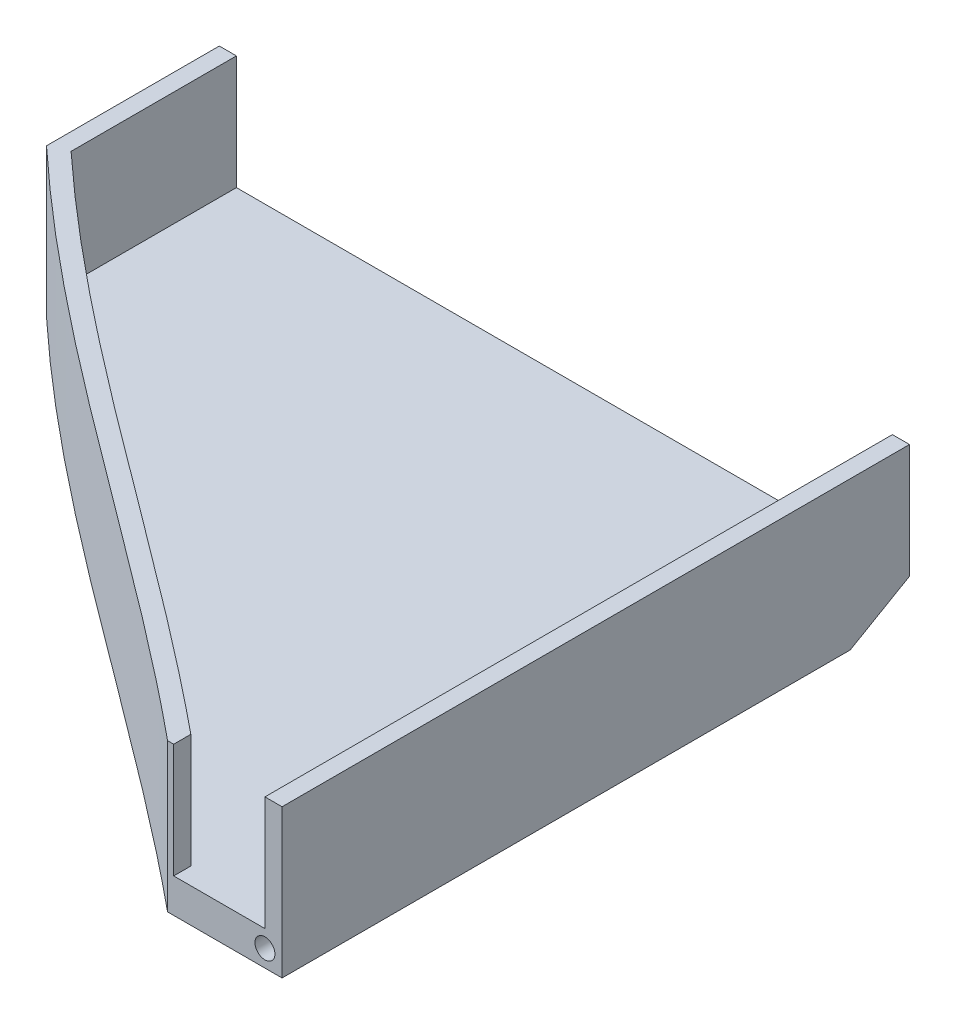
ISO-10303-21;
HEADER;
FILE_DESCRIPTION(('STEP AP214'),'2;1');
FILE_NAME('part.step','',(''),(''),'','','');
FILE_SCHEMA(('AUTOMOTIVE_DESIGN { 1 0 10303 214 1 1 1 1 }'));
ENDSEC;
DATA;
#1=APPLICATION_CONTEXT('core data for automotive mechanical design processes');
#2=APPLICATION_PROTOCOL_DEFINITION('international standard','automotive_design',2000,#1);
#3=PRODUCT_CONTEXT('',#1,'mechanical');
#4=PRODUCT('Part','Part','',(#3));
#5=PRODUCT_RELATED_PRODUCT_CATEGORY('part','',(#4));
#6=PRODUCT_DEFINITION_FORMATION('','',#4);
#7=PRODUCT_DEFINITION_CONTEXT('part definition',#1,'design');
#8=PRODUCT_DEFINITION('design','',#6,#7);
#9=PRODUCT_DEFINITION_SHAPE('','',#8);
#10=(LENGTH_UNIT() NAMED_UNIT(*) SI_UNIT(.MILLI.,.METRE.));
#11=(NAMED_UNIT(*) PLANE_ANGLE_UNIT() SI_UNIT($,.RADIAN.));
#12=(NAMED_UNIT(*) SI_UNIT($,.STERADIAN.) SOLID_ANGLE_UNIT());
#13=UNCERTAINTY_MEASURE_WITH_UNIT(LENGTH_MEASURE(1.E-05),#10,'distance_accuracy_value','');
#14=(GEOMETRIC_REPRESENTATION_CONTEXT(3) GLOBAL_UNCERTAINTY_ASSIGNED_CONTEXT((#13)) GLOBAL_UNIT_ASSIGNED_CONTEXT((#10,
#11,#12)) REPRESENTATION_CONTEXT('',''));
#15=CARTESIAN_POINT('',(0.,0.,0.));
#16=DIRECTION('',(0.,0.,1.));
#17=DIRECTION('',(1.,0.,0.));
#18=AXIS2_PLACEMENT_3D('',#15,#16,#17);
#19=CARTESIAN_POINT('',(0.,6.,0.));
#20=DIRECTION('',(-1.,0.,0.));
#21=DIRECTION('',(0.,0.,1.));
#22=AXIS2_PLACEMENT_3D('',#19,#20,#21);
#23=PLANE('',#22);
#24=DIRECTION('',(0.,-0.499999999999998,0.86602540378444));
#25=VECTOR('',#24,1.);
#26=CARTESIAN_POINT('',(0.,6.,0.));
#27=LINE('',#26,#25);
#28=CARTESIAN_POINT('',(0.,6.,0.));
#29=VERTEX_POINT('',#28);
#30=CARTESIAN_POINT('',(0.,0.,10.3923048454133));
#31=VERTEX_POINT('',#30);
#32=EDGE_CURVE('E64',#29,#31,#27,.T.);
#33=ORIENTED_EDGE('',*,*,#32,.F.);
#34=DIRECTION('',(0.,-1.,0.));
#35=VECTOR('',#34,1.);
#36=CARTESIAN_POINT('',(0.,6.,0.));
#37=LINE('',#36,#35);
#38=CARTESIAN_POINT('',(0.,26.,0.));
#39=VERTEX_POINT('',#38);
#40=EDGE_CURVE('E11',#39,#29,#37,.T.);
#41=ORIENTED_EDGE('',*,*,#40,.F.);
#42=DIRECTION('',(0.,0.,-1.));
#43=VECTOR('',#42,1.);
#44=CARTESIAN_POINT('',(0.,26.,110.));
#45=LINE('',#44,#43);
#46=CARTESIAN_POINT('',(0.,26.,110.));
#47=VERTEX_POINT('',#46);
#48=EDGE_CURVE('E317',#47,#39,#45,.T.);
#49=ORIENTED_EDGE('',*,*,#48,.F.);
#50=DIRECTION('',(0.,-1.,0.));
#51=VECTOR('',#50,1.);
#52=CARTESIAN_POINT('',(0.,6.,110.));
#53=LINE('',#52,#51);
#54=CARTESIAN_POINT('',(0.,0.,110.));
#55=VERTEX_POINT('',#54);
#56=EDGE_CURVE('E278',#47,#55,#53,.T.);
#57=ORIENTED_EDGE('',*,*,#56,.T.);
#58=DIRECTION('',(0.,0.,-1.));
#59=VECTOR('',#58,1.);
#60=CARTESIAN_POINT('',(0.,0.,0.));
#61=LINE('',#60,#59);
#62=EDGE_CURVE('E279',#55,#31,#61,.T.);
#63=ORIENTED_EDGE('',*,*,#62,.T.);
#64=EDGE_LOOP('',(#33,#41,#49,#57,#63));
#65=FACE_BOUND('',#64,.T.);
#66=ADVANCED_FACE('F45',(#65),#23,.F.);
#67=CARTESIAN_POINT('',(0.,6.,0.));
#68=DIRECTION('',(0.,0.,1.));
#69=DIRECTION('',(1.,0.,0.));
#70=AXIS2_PLACEMENT_3D('',#67,#68,#69);
#71=PLANE('',#70);
#72=DIRECTION('',(1.,0.,0.));
#73=VECTOR('',#72,1.);
#74=CARTESIAN_POINT('',(0.,6.,0.));
#75=LINE('',#74,#73);
#76=CARTESIAN_POINT('',(-121.,6.,0.));
#77=VERTEX_POINT('',#76);
#78=CARTESIAN_POINT('',(-118.,6.,0.));
#79=VERTEX_POINT('',#78);
#80=EDGE_CURVE('E137',#77,#79,#75,.T.);
#81=ORIENTED_EDGE('',*,*,#80,.F.);
#82=DIRECTION('',(0.,-1.,0.));
#83=VECTOR('',#82,1.);
#84=CARTESIAN_POINT('',(-121.,6.,0.));
#85=LINE('',#84,#83);
#86=CARTESIAN_POINT('',(-121.,26.,0.));
#87=VERTEX_POINT('',#86);
#88=EDGE_CURVE('E56',#87,#77,#85,.T.);
#89=ORIENTED_EDGE('',*,*,#88,.F.);
#90=DIRECTION('',(-1.,0.,0.));
#91=VECTOR('',#90,1.);
#92=CARTESIAN_POINT('',(-118.,26.,0.));
#93=LINE('',#92,#91);
#94=CARTESIAN_POINT('',(-118.,26.,0.));
#95=VERTEX_POINT('',#94);
#96=EDGE_CURVE('E169',#95,#87,#93,.T.);
#97=ORIENTED_EDGE('',*,*,#96,.F.);
#98=DIRECTION('',(0.,-1.,0.));
#99=VECTOR('',#98,1.);
#100=CARTESIAN_POINT('',(-118.,26.,0.));
#101=LINE('',#100,#99);
#102=EDGE_CURVE('E163',#95,#79,#101,.T.);
#103=ORIENTED_EDGE('',*,*,#102,.T.);
#104=EDGE_LOOP('',(#81,#89,#97,#103));
#105=FACE_BOUND('',#104,.T.);
#106=ADVANCED_FACE('F171',(#105),#71,.F.);
#107=CARTESIAN_POINT('',(-2.99999999999999,6.,0.));
#108=VERTEX_POINT('',#107);
#109=EDGE_CURVE('E148',#108,#29,#75,.T.);
#110=ORIENTED_EDGE('',*,*,#109,.F.);
#111=DIRECTION('',(0.,-1.,0.));
#112=VECTOR('',#111,1.);
#113=CARTESIAN_POINT('',(-3.,26.,0.));
#114=LINE('',#113,#112);
#115=CARTESIAN_POINT('',(-3.,26.,0.));
#116=VERTEX_POINT('',#115);
#117=EDGE_CURVE('E333',#116,#108,#114,.T.);
#118=ORIENTED_EDGE('',*,*,#117,.F.);
#119=DIRECTION('',(-1.,0.,0.));
#120=VECTOR('',#119,1.);
#121=CARTESIAN_POINT('',(0.,26.,0.));
#122=LINE('',#121,#120);
#123=EDGE_CURVE('E324',#39,#116,#122,.T.);
#124=ORIENTED_EDGE('',*,*,#123,.F.);
#125=ORIENTED_EDGE('',*,*,#40,.T.);
#126=EDGE_LOOP('',(#110,#118,#124,#125));
#127=FACE_BOUND('',#126,.T.);
#128=ADVANCED_FACE('F396',(#127),#71,.F.);
#129=CARTESIAN_POINT('',(-121.,6.,0.));
#130=DIRECTION('',(1.,0.,0.));
#131=DIRECTION('',(0.,0.,-1.));
#132=AXIS2_PLACEMENT_3D('',#129,#130,#131);
#133=PLANE('',#132);
#134=DIRECTION('',(0.,0.499999999999998,-0.86602540378444));
#135=VECTOR('',#134,1.);
#136=CARTESIAN_POINT('',(-121.,6.,0.));
#137=LINE('',#136,#135);
#138=CARTESIAN_POINT('',(-121.,0.,10.3923048454133));
#139=VERTEX_POINT('',#138);
#140=EDGE_CURVE('E142',#139,#77,#137,.T.);
#141=ORIENTED_EDGE('',*,*,#140,.F.);
#142=DIRECTION('',(0.,0.,1.));
#143=VECTOR('',#142,1.);
#144=CARTESIAN_POINT('',(-121.,0.,0.));
#145=LINE('',#144,#143);
#146=CARTESIAN_POINT('',(-121.,0.,30.298554482171));
#147=VERTEX_POINT('',#146);
#148=EDGE_CURVE('E283',#139,#147,#145,.T.);
#149=ORIENTED_EDGE('',*,*,#148,.T.);
#150=DIRECTION('',(0.,-1.,0.));
#151=VECTOR('',#150,1.);
#152=CARTESIAN_POINT('',(-121.,6.,30.298554482171));
#153=LINE('',#152,#151);
#154=CARTESIAN_POINT('',(-121.,26.,30.298554482171));
#155=VERTEX_POINT('',#154);
#156=EDGE_CURVE('E304',#155,#147,#153,.T.);
#157=ORIENTED_EDGE('',*,*,#156,.F.);
#158=DIRECTION('',(0.,0.,1.));
#159=VECTOR('',#158,1.);
#160=CARTESIAN_POINT('',(-121.,26.,0.));
#161=LINE('',#160,#159);
#162=EDGE_CURVE('E255',#87,#155,#161,.T.);
#163=ORIENTED_EDGE('',*,*,#162,.F.);
#164=ORIENTED_EDGE('',*,*,#88,.T.);
#165=EDGE_LOOP('',(#141,#149,#157,#163,#164));
#166=FACE_BOUND('',#165,.T.);
#167=ADVANCED_FACE('F267',(#166),#133,.F.);
#168=CARTESIAN_POINT('',(-71.1642285744351,0.,70.9353569360221));
#169=DIRECTION('',(0.,-1.,0.));
#170=DIRECTION('',(0.,0.,-1.));
#171=AXIS2_PLACEMENT_3D('',#168,#169,#170);
#172=PLANE('',#171);
#173=ORIENTED_EDGE('',*,*,#148,.F.);
#174=DIRECTION('',(1.,0.,0.));
#175=VECTOR('',#174,1.);
#176=CARTESIAN_POINT('',(-71.1642285744351,0.,10.3923048454133));
#177=LINE('',#176,#175);
#178=EDGE_CURVE('E359',#139,#31,#177,.T.);
#179=ORIENTED_EDGE('',*,*,#178,.T.);
#180=ORIENTED_EDGE('',*,*,#62,.F.);
#181=DIRECTION('',(1.,0.,0.));
#182=VECTOR('',#181,1.);
#183=CARTESIAN_POINT('',(-20.07,0.,110.));
#184=LINE('',#183,#182);
#185=CARTESIAN_POINT('',(-20.07,0.,110.));
#186=VERTEX_POINT('',#185);
#187=EDGE_CURVE('E156',#186,#55,#184,.T.);
#188=ORIENTED_EDGE('',*,*,#187,.F.);
#189=CARTESIAN_POINT('',(-121.,0.,30.298554482171));
#190=CARTESIAN_POINT('',(-89.5585333560664,0.,59.6550867770387));
#191=CARTESIAN_POINT('',(-53.1894095090938,0.,82.7396802249631));
#192=CARTESIAN_POINT('',(-20.07,0.,110.));
#193=B_SPLINE_CURVE_WITH_KNOTS('',3,(#189,#190,#191,#192),.UNSPECIFIED.,.F.,.F.,(4,4),(0.,1.),.UNSPECIFIED.);
#194=EDGE_CURVE('E287',#147,#186,#193,.T.);
#195=ORIENTED_EDGE('',*,*,#194,.F.);
#196=EDGE_LOOP('',(#173,#179,#180,#188,#195));
#197=FACE_BOUND('',#196,.T.);
#198=ADVANCED_FACE('F358',(#197),#172,.T.);
#199=CARTESIAN_POINT('',(-3.,3.,110.));
#200=DIRECTION('',(0.,0.,-1.));
#201=DIRECTION('',(-1.,0.,0.));
#202=AXIS2_PLACEMENT_3D('',#199,#200,#201);
#203=CYLINDRICAL_SURFACE('',#202,1.75);
#204=CARTESIAN_POINT('',(-3.,3.,110.));
#205=DIRECTION('',(0.,0.,-1.));
#206=DIRECTION('',(-1.,0.,0.));
#207=AXIS2_PLACEMENT_3D('',#204,#205,#206);
#208=CIRCLE('',#207,1.75);
#209=CARTESIAN_POINT('',(-4.75,3.,110.));
#210=VERTEX_POINT('',#209);
#211=EDGE_CURVE('E284',#210,#210,#208,.T.);
#212=ORIENTED_EDGE('',*,*,#211,.F.);
#213=EDGE_LOOP('',(#212));
#214=FACE_BOUND('',#213,.T.);
#215=CARTESIAN_POINT('',(-3.,3.,5.19615242270666));
#216=DIRECTION('',(0.,-0.86602540378444,-0.499999999999998));
#217=DIRECTION('',(0.,0.499999999999998,-0.86602540378444));
#218=AXIS2_PLACEMENT_3D('',#215,#216,#217);
#219=ELLIPSE('',#218,3.50000000000001,1.75);
#220=CARTESIAN_POINT('',(-3.,4.75,2.16506350946111));
#221=VERTEX_POINT('',#220);
#222=EDGE_CURVE('E378',#221,#221,#219,.F.);
#223=ORIENTED_EDGE('',*,*,#222,.F.);
#224=EDGE_LOOP('',(#223));
#225=FACE_BOUND('',#224,.T.);
#226=ADVANCED_FACE('F384',(#214,#225),#203,.F.);
#227=CARTESIAN_POINT('',(-71.1642285744351,6.,70.9353569360221));
#228=DIRECTION('',(0.,-1.,0.));
#229=DIRECTION('',(0.,0.,-1.));
#230=AXIS2_PLACEMENT_3D('',#227,#228,#229);
#231=PLANE('',#230);
#232=DIRECTION('',(0.,0.,1.));
#233=VECTOR('',#232,1.);
#234=CARTESIAN_POINT('',(-2.99999999999999,6.,107.));
#235=LINE('',#234,#233);
#236=CARTESIAN_POINT('',(-2.99999999999999,6.,110.));
#237=VERTEX_POINT('',#236);
#238=EDGE_CURVE('E152',#108,#237,#235,.T.);
#239=ORIENTED_EDGE('',*,*,#238,.F.);
#240=DIRECTION('',(-1.,0.,0.));
#241=VECTOR('',#240,1.);
#242=CARTESIAN_POINT('',(0.,6.,0.));
#243=LINE('',#242,#241);
#244=EDGE_CURVE('E139',#108,#79,#243,.T.);
#245=ORIENTED_EDGE('',*,*,#244,.T.);
#246=DIRECTION('',(0.,0.,-1.));
#247=VECTOR('',#246,1.);
#248=CARTESIAN_POINT('',(-118.,6.,3.));
#249=LINE('',#248,#247);
#250=CARTESIAN_POINT('',(-118.,6.,28.9919096023618));
#251=VERTEX_POINT('',#250);
#252=EDGE_CURVE('E72',#251,#79,#249,.T.);
#253=ORIENTED_EDGE('',*,*,#252,.F.);
#254=CARTESIAN_POINT('',(-18.9958727807811,6.,107.));
#255=CARTESIAN_POINT('',(-35.258396573788,6.,93.6697709178433));
#256=CARTESIAN_POINT('',(-52.2742064898855,6.,81.3252064171606));
#257=CARTESIAN_POINT('',(-77.5136368750899,6.,62.4365396093481));
#258=CARTESIAN_POINT('',(-85.879615069599,6.,56.07765028145));
#259=CARTESIAN_POINT('',(-102.272955065731,6.,42.9240989046823));
#260=CARTESIAN_POINT('',(-110.28982418113,6.,36.1372064162419));
#261=CARTESIAN_POINT('',(-118.,6.,28.9919096023618));
#262=B_SPLINE_CURVE_WITH_KNOTS('',3,(#254,#255,#256,#257,#258,#259,#260,#261),.UNSPECIFIED.,.F.,
.F.,(4,2,2,4),(0.,0.5,0.75,1.),.UNSPECIFIED.);
#263=CARTESIAN_POINT('',(-18.9958727807811,6.,107.));
#264=VERTEX_POINT('',#263);
#265=EDGE_CURVE('E168',#264,#251,#262,.T.);
#266=ORIENTED_EDGE('',*,*,#265,.F.);
#267=DIRECTION('',(0.,0.,-1.));
#268=VECTOR('',#267,1.);
#269=CARTESIAN_POINT('',(-18.9958727807811,6.,107.));
#270=LINE('',#269,#268);
#271=CARTESIAN_POINT('',(-18.9958727807811,6.,110.));
#272=VERTEX_POINT('',#271);
#273=EDGE_CURVE('E216',#272,#264,#270,.T.);
#274=ORIENTED_EDGE('',*,*,#273,.F.);
#275=DIRECTION('',(1.,0.,0.));
#276=VECTOR('',#275,1.);
#277=CARTESIAN_POINT('',(-20.07,6.,110.));
#278=LINE('',#277,#276);
#279=EDGE_CURVE('E155',#272,#237,#278,.T.);
#280=ORIENTED_EDGE('',*,*,#279,.T.);
#281=EDGE_LOOP('',(#239,#245,#253,#266,#274,#280));
#282=FACE_BOUND('',#281,.T.);
#283=ADVANCED_FACE('F150',(#282),#231,.F.);
#284=CARTESIAN_POINT('',(-121.,6.,30.298554482171));
#285=CARTESIAN_POINT('',(-89.5585333560664,6.,59.6550867770387));
#286=CARTESIAN_POINT('',(-53.1894095090938,6.,82.7396802249631));
#287=CARTESIAN_POINT('',(-20.07,6.,110.));
#288=B_SPLINE_CURVE_WITH_KNOTS('',3,(#284,#285,#286,#287),.UNSPECIFIED.,.F.,.F.,(4,4),(0.,1.),.UNSPECIFIED.);
#289=DIRECTION('',(0.,-1.,0.));
#290=VECTOR('',#289,1.);
#291=SURFACE_OF_LINEAR_EXTRUSION('',#288,#290);
#292=ORIENTED_EDGE('',*,*,#194,.T.);
#293=DIRECTION('',(0.,-1.,0.));
#294=VECTOR('',#293,1.);
#295=CARTESIAN_POINT('',(-20.07,6.,110.));
#296=LINE('',#295,#294);
#297=CARTESIAN_POINT('',(-20.07,26.,110.));
#298=VERTEX_POINT('',#297);
#299=EDGE_CURVE('E300',#298,#186,#296,.T.);
#300=ORIENTED_EDGE('',*,*,#299,.F.);
#301=CARTESIAN_POINT('',(-121.,26.,30.298554482171));
#302=CARTESIAN_POINT('',(-119.028933344234,26.,32.1389599739121));
#303=CARTESIAN_POINT('',(-117.036616625847,26.,33.956388226173));
#304=CARTESIAN_POINT('',(-113.014769303158,26.,37.5491235556144));
#305=CARTESIAN_POINT('',(-110.985243286696,26.,39.3244357645284));
#306=CARTESIAN_POINT('',(-106.895758739631,26.,42.835520820486));
#307=CARTESIAN_POINT('',(-104.835831572187,26.,44.5713302810336));
#308=CARTESIAN_POINT('',(-100.688348677871,26.,48.0097086941523));
#309=CARTESIAN_POINT('',(-98.6007920342474,26.,49.7122765390987));
#310=CARTESIAN_POINT('',(-92.3057681201358,26.,54.7753924530917));
#311=CARTESIAN_POINT('',(-88.063879472756,26.,58.0931104935808));
#312=CARTESIAN_POINT('',(-79.5212495058597,26.,64.6553012100159));
#313=CARTESIAN_POINT('',(-75.2204820179266,26.,67.8997394997139));
#314=CARTESIAN_POINT('',(-62.3638185567545,26.,77.5215025718673));
#315=CARTESIAN_POINT('',(-53.7718369829558,26.,83.8504055941663));
#316=CARTESIAN_POINT('',(-40.9983678302714,26.,93.4891833741317));
#317=CARTESIAN_POINT('',(-36.7615262936329,26.,96.7248445154117));
#318=CARTESIAN_POINT('',(-28.3561044034044,26.,103.285663180482));
#319=CARTESIAN_POINT('',(-24.1875427555875,26.,106.610844590607));
#320=CARTESIAN_POINT('',(-20.07,26.,110.));
#321=B_SPLINE_CURVE_WITH_KNOTS('',3,(#301,#302,#303,#304,#305,#306,#307,#308,#309,#310,#311,
#312,#313,#314,#315,#316,#317,#318,#319,#320),.UNSPECIFIED.,.F.,.F.,(4,2,2,2,2,2,2,2,2,4),(0.,
8.08970513913306,16.1784194519528,24.2593032369067,32.3404558223582,48.4946235820849,
64.6562204278161,96.6696563115006,112.661859411041,128.658372785951),.UNSPECIFIED.);
#322=EDGE_CURVE('E241',#155,#298,#321,.T.);
#323=ORIENTED_EDGE('',*,*,#322,.F.);
#324=ORIENTED_EDGE('',*,*,#156,.T.);
#325=EDGE_LOOP('',(#292,#300,#323,#324));
#326=FACE_BOUND('',#325,.T.);
#327=ADVANCED_FACE('F258',(#326),#291,.F.);
#328=CARTESIAN_POINT('',(-20.07,6.,110.));
#329=DIRECTION('',(0.,0.,-1.));
#330=DIRECTION('',(-1.,0.,0.));
#331=AXIS2_PLACEMENT_3D('',#328,#329,#330);
#332=PLANE('',#331);
#333=ORIENTED_EDGE('',*,*,#211,.T.);
#334=EDGE_LOOP('',(#333));
#335=FACE_BOUND('',#334,.T.);
#336=ORIENTED_EDGE('',*,*,#187,.T.);
#337=ORIENTED_EDGE('',*,*,#56,.F.);
#338=DIRECTION('',(1.,0.,0.));
#339=VECTOR('',#338,1.);
#340=CARTESIAN_POINT('',(-2.99999999999999,26.,110.));
#341=LINE('',#340,#339);
#342=CARTESIAN_POINT('',(-2.99999999999999,26.,110.));
#343=VERTEX_POINT('',#342);
#344=EDGE_CURVE('E328',#343,#47,#341,.T.);
#345=ORIENTED_EDGE('',*,*,#344,.F.);
#346=DIRECTION('',(0.,-1.,0.));
#347=VECTOR('',#346,1.);
#348=CARTESIAN_POINT('',(-2.99999999999999,26.,110.));
#349=LINE('',#348,#347);
#350=EDGE_CURVE('E330',#343,#237,#349,.T.);
#351=ORIENTED_EDGE('',*,*,#350,.T.);
#352=ORIENTED_EDGE('',*,*,#279,.F.);
#353=DIRECTION('',(0.,-1.,0.));
#354=VECTOR('',#353,1.);
#355=CARTESIAN_POINT('',(-18.9958727807811,26.,110.));
#356=LINE('',#355,#354);
#357=CARTESIAN_POINT('',(-18.9958727807811,26.,110.));
#358=VERTEX_POINT('',#357);
#359=EDGE_CURVE('E184',#358,#272,#356,.T.);
#360=ORIENTED_EDGE('',*,*,#359,.F.);
#361=DIRECTION('',(1.,0.,0.));
#362=VECTOR('',#361,1.);
#363=CARTESIAN_POINT('',(-20.07,26.,110.));
#364=LINE('',#363,#362);
#365=EDGE_CURVE('E190',#298,#358,#364,.T.);
#366=ORIENTED_EDGE('',*,*,#365,.F.);
#367=ORIENTED_EDGE('',*,*,#299,.T.);
#368=EDGE_LOOP('',(#336,#337,#345,#351,#352,#360,#366,#367));
#369=FACE_BOUND('',#368,.T.);
#370=ADVANCED_FACE('F264',(#335,#369),#332,.F.);
#371=CARTESIAN_POINT('',(-18.9958727807811,26.,107.));
#372=DIRECTION('',(-1.,0.,0.));
#373=DIRECTION('',(0.,0.,1.));
#374=AXIS2_PLACEMENT_3D('',#371,#372,#373);
#375=PLANE('',#374);
#376=ORIENTED_EDGE('',*,*,#273,.T.);
#377=DIRECTION('',(0.,-1.,0.));
#378=VECTOR('',#377,1.);
#379=CARTESIAN_POINT('',(-18.9958727807811,26.,107.));
#380=LINE('',#379,#378);
#381=CARTESIAN_POINT('',(-18.9958727807811,26.,107.));
#382=VERTEX_POINT('',#381);
#383=EDGE_CURVE('E180',#382,#264,#380,.T.);
#384=ORIENTED_EDGE('',*,*,#383,.F.);
#385=DIRECTION('',(0.,0.,-1.));
#386=VECTOR('',#385,1.);
#387=CARTESIAN_POINT('',(-18.9958727807811,26.,107.));
#388=LINE('',#387,#386);
#389=EDGE_CURVE('E234',#358,#382,#388,.T.);
#390=ORIENTED_EDGE('',*,*,#389,.F.);
#391=ORIENTED_EDGE('',*,*,#359,.T.);
#392=EDGE_LOOP('',(#376,#384,#390,#391));
#393=FACE_BOUND('',#392,.T.);
#394=ADVANCED_FACE('F201',(#393),#375,.F.);
#395=CARTESIAN_POINT('',(-18.9958727807811,26.,107.));
#396=CARTESIAN_POINT('',(-35.258396573788,26.,93.6697709178433));
#397=CARTESIAN_POINT('',(-52.2742064898855,26.,81.3252064171606));
#398=CARTESIAN_POINT('',(-77.5136368750899,26.,62.4365396093481));
#399=CARTESIAN_POINT('',(-85.879615069599,26.,56.07765028145));
#400=CARTESIAN_POINT('',(-102.272955065731,26.,42.9240989046823));
#401=CARTESIAN_POINT('',(-110.28982418113,26.,36.1372064162419));
#402=CARTESIAN_POINT('',(-118.,26.,28.9919096023618));
#403=B_SPLINE_CURVE_WITH_KNOTS('',3,(#395,#396,#397,#398,#399,#400,#401,#402),.UNSPECIFIED.,.F.,
.F.,(4,2,2,4),(0.,0.5,0.75,1.),.UNSPECIFIED.);
#404=DIRECTION('',(0.,-1.,0.));
#405=VECTOR('',#404,1.);
#406=SURFACE_OF_LINEAR_EXTRUSION('',#403,#405);
#407=ORIENTED_EDGE('',*,*,#265,.T.);
#408=DIRECTION('',(0.,-1.,0.));
#409=VECTOR('',#408,1.);
#410=CARTESIAN_POINT('',(-118.,26.,28.9919096023618));
#411=LINE('',#410,#409);
#412=CARTESIAN_POINT('',(-118.,26.,28.9919096023618));
#413=VERTEX_POINT('',#412);
#414=EDGE_CURVE('E166',#413,#251,#411,.T.);
#415=ORIENTED_EDGE('',*,*,#414,.F.);
#416=CARTESIAN_POINT('',(-118.,26.,28.9919096023618));
#417=CARTESIAN_POINT('',(-110.28982418113,26.,36.1372064162419));
#418=CARTESIAN_POINT('',(-102.272955065731,26.,42.9240989046823));
#419=CARTESIAN_POINT('',(-85.879615069599,26.,56.07765028145));
#420=CARTESIAN_POINT('',(-77.5136368750899,26.,62.4365396093481));
#421=CARTESIAN_POINT('',(-52.2742064898855,26.,81.3252064171606));
#422=CARTESIAN_POINT('',(-35.258396573788,26.,93.6697709178433));
#423=CARTESIAN_POINT('',(-18.9958727807811,26.,107.));
#424=B_SPLINE_CURVE_WITH_KNOTS('',3,(#416,#417,#418,#419,#420,#421,#422,#423),.UNSPECIFIED.,.F.,
.F.,(4,2,2,4),(0.,0.25,0.5,1.),.UNSPECIFIED.);
#425=EDGE_CURVE('E178',#382,#413,#424,.F.);
#426=ORIENTED_EDGE('',*,*,#425,.F.);
#427=ORIENTED_EDGE('',*,*,#383,.T.);
#428=EDGE_LOOP('',(#407,#415,#426,#427));
#429=FACE_BOUND('',#428,.T.);
#430=ADVANCED_FACE('F196',(#429),#406,.F.);
#431=CARTESIAN_POINT('',(-118.,26.,3.));
#432=DIRECTION('',(-1.,0.,0.));
#433=DIRECTION('',(0.,0.,1.));
#434=AXIS2_PLACEMENT_3D('',#431,#432,#433);
#435=PLANE('',#434);
#436=ORIENTED_EDGE('',*,*,#252,.T.);
#437=ORIENTED_EDGE('',*,*,#102,.F.);
#438=DIRECTION('',(0.,0.,-1.));
#439=VECTOR('',#438,1.);
#440=CARTESIAN_POINT('',(-118.,26.,3.));
#441=LINE('',#440,#439);
#442=EDGE_CURVE('E174',#413,#95,#441,.T.);
#443=ORIENTED_EDGE('',*,*,#442,.F.);
#444=ORIENTED_EDGE('',*,*,#414,.T.);
#445=EDGE_LOOP('',(#436,#437,#443,#444));
#446=FACE_BOUND('',#445,.T.);
#447=ADVANCED_FACE('F161',(#446),#435,.F.);
#448=CARTESIAN_POINT('',(-71.1642285744351,26.,70.9353569360221));
#449=DIRECTION('',(0.,-1.,0.));
#450=DIRECTION('',(0.,0.,-1.));
#451=AXIS2_PLACEMENT_3D('',#448,#449,#450);
#452=PLANE('',#451);
#453=ORIENTED_EDGE('',*,*,#96,.T.);
#454=ORIENTED_EDGE('',*,*,#162,.T.);
#455=ORIENTED_EDGE('',*,*,#322,.T.);
#456=ORIENTED_EDGE('',*,*,#365,.T.);
#457=ORIENTED_EDGE('',*,*,#389,.T.);
#458=ORIENTED_EDGE('',*,*,#425,.T.);
#459=ORIENTED_EDGE('',*,*,#442,.T.);
#460=EDGE_LOOP('',(#453,#454,#455,#456,#457,#458,#459));
#461=FACE_BOUND('',#460,.T.);
#462=ADVANCED_FACE('F244',(#461),#452,.F.);
#463=CARTESIAN_POINT('',(-2.99999999999999,26.,107.));
#464=DIRECTION('',(1.,0.,0.));
#465=DIRECTION('',(0.,0.,-1.));
#466=AXIS2_PLACEMENT_3D('',#463,#464,#465);
#467=PLANE('',#466);
#468=ORIENTED_EDGE('',*,*,#238,.T.);
#469=ORIENTED_EDGE('',*,*,#350,.F.);
#470=DIRECTION('',(0.,0.,1.));
#471=VECTOR('',#470,1.);
#472=CARTESIAN_POINT('',(-3.,26.,3.));
#473=LINE('',#472,#471);
#474=EDGE_CURVE('E366',#116,#343,#473,.T.);
#475=ORIENTED_EDGE('',*,*,#474,.F.);
#476=ORIENTED_EDGE('',*,*,#117,.T.);
#477=EDGE_LOOP('',(#468,#469,#475,#476));
#478=FACE_BOUND('',#477,.T.);
#479=ADVANCED_FACE('F407',(#478),#467,.F.);
#480=CARTESIAN_POINT('',(0.,26.,0.));
#481=DIRECTION('',(0.,1.,0.));
#482=DIRECTION('',(0.,0.,1.));
#483=AXIS2_PLACEMENT_3D('',#480,#481,#482);
#484=PLANE('',#483);
#485=ORIENTED_EDGE('',*,*,#48,.T.);
#486=ORIENTED_EDGE('',*,*,#123,.T.);
#487=ORIENTED_EDGE('',*,*,#474,.T.);
#488=ORIENTED_EDGE('',*,*,#344,.T.);
#489=EDGE_LOOP('',(#485,#486,#487,#488));
#490=FACE_BOUND('',#489,.T.);
#491=ADVANCED_FACE('F365',(#490),#484,.T.);
#492=CARTESIAN_POINT('',(0.,4.50000000000001,2.59807621135331));
#493=DIRECTION('',(0.,-0.86602540378444,-0.499999999999998));
#494=DIRECTION('',(0.,0.499999999999998,-0.86602540378444));
#495=AXIS2_PLACEMENT_3D('',#492,#493,#494);
#496=PLANE('',#495);
#497=ORIENTED_EDGE('',*,*,#222,.T.);
#498=EDGE_LOOP('',(#497));
#499=FACE_BOUND('',#498,.T.);
#500=ORIENTED_EDGE('',*,*,#109,.T.);
#501=ORIENTED_EDGE('',*,*,#32,.T.);
#502=ORIENTED_EDGE('',*,*,#178,.F.);
#503=ORIENTED_EDGE('',*,*,#140,.T.);
#504=ORIENTED_EDGE('',*,*,#80,.T.);
#505=ORIENTED_EDGE('',*,*,#244,.F.);
#506=EDGE_LOOP('',(#500,#501,#502,#503,#504,#505));
#507=FACE_BOUND('',#506,.T.);
#508=ADVANCED_FACE('F138',(#499,#507),#496,.T.);
#509=CLOSED_SHELL('',(#66,#106,#128,#167,#198,#226,#283,#327,#370,#394,#430,#447,#462,#479,#491,#508));
#510=MANIFOLD_SOLID_BREP('B2',#509);
#511=ADVANCED_BREP_SHAPE_REPRESENTATION('',(#18,#510),#14);
#512=SHAPE_DEFINITION_REPRESENTATION(#9,#511);
ENDSEC;
END-ISO-10303-21;
